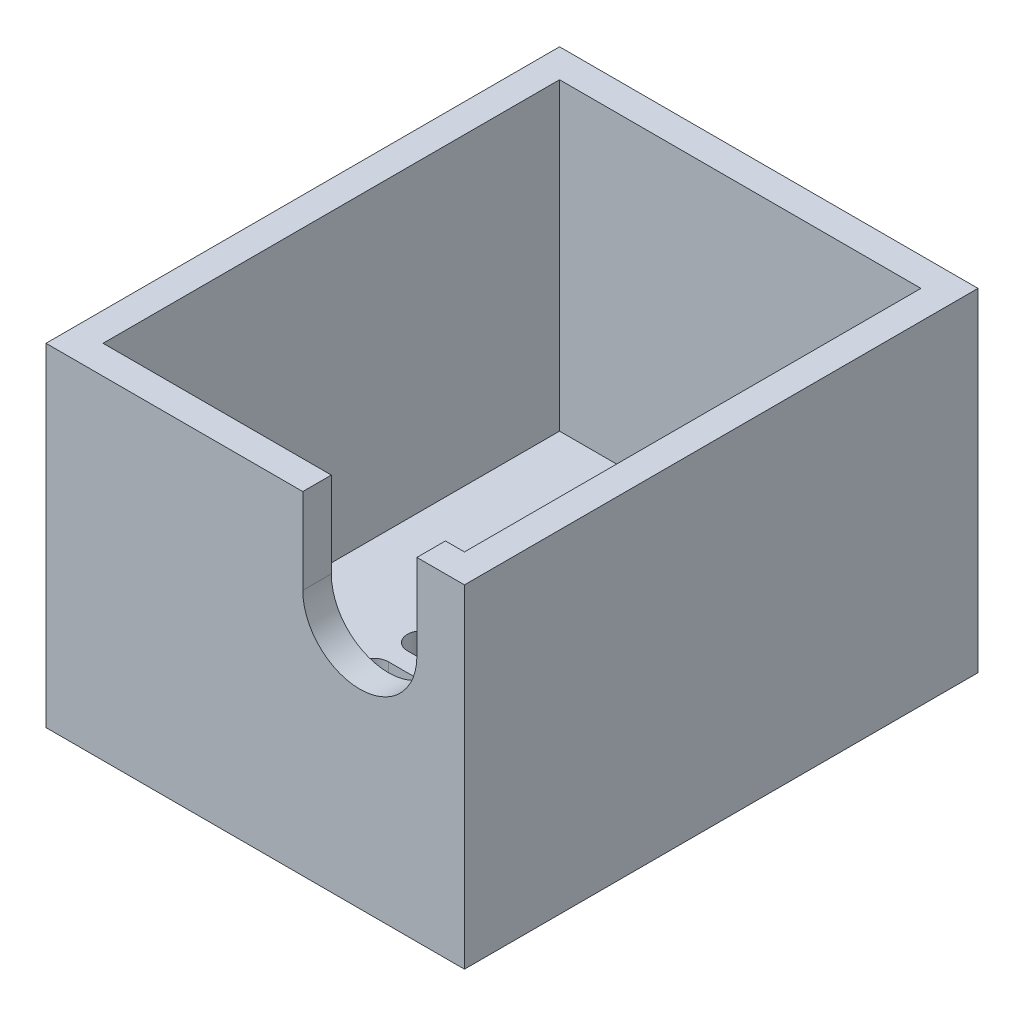
ISO-10303-21;
HEADER;
FILE_DESCRIPTION(('STEP AP214'),'2;1');
FILE_NAME('part.step','',(''),(''),'','','');
FILE_SCHEMA(('AUTOMOTIVE_DESIGN { 1 0 10303 214 1 1 1 1 }'));
ENDSEC;
DATA;
#1=APPLICATION_CONTEXT('core data for automotive mechanical design processes');
#2=APPLICATION_PROTOCOL_DEFINITION('international standard','automotive_design',2000,#1);
#3=PRODUCT_CONTEXT('',#1,'mechanical');
#4=PRODUCT('Part','Part','',(#3));
#5=PRODUCT_RELATED_PRODUCT_CATEGORY('part','',(#4));
#6=PRODUCT_DEFINITION_FORMATION('','',#4);
#7=PRODUCT_DEFINITION_CONTEXT('part definition',#1,'design');
#8=PRODUCT_DEFINITION('design','',#6,#7);
#9=PRODUCT_DEFINITION_SHAPE('','',#8);
#10=(LENGTH_UNIT() NAMED_UNIT(*) SI_UNIT(.MILLI.,.METRE.));
#11=(NAMED_UNIT(*) PLANE_ANGLE_UNIT() SI_UNIT($,.RADIAN.));
#12=(NAMED_UNIT(*) SI_UNIT($,.STERADIAN.) SOLID_ANGLE_UNIT());
#13=UNCERTAINTY_MEASURE_WITH_UNIT(LENGTH_MEASURE(1.E-05),#10,'distance_accuracy_value','');
#14=(GEOMETRIC_REPRESENTATION_CONTEXT(3) GLOBAL_UNCERTAINTY_ASSIGNED_CONTEXT((#13)) GLOBAL_UNIT_ASSIGNED_CONTEXT((#10,
#11,#12)) REPRESENTATION_CONTEXT('',''));
#15=CARTESIAN_POINT('',(0.,0.,0.));
#16=DIRECTION('',(0.,0.,1.));
#17=DIRECTION('',(1.,0.,0.));
#18=AXIS2_PLACEMENT_3D('',#15,#16,#17);
#19=CARTESIAN_POINT('',(0.,0.,0.));
#20=DIRECTION('',(0.,1.,0.));
#21=DIRECTION('',(0.,0.,1.));
#22=AXIS2_PLACEMENT_3D('',#19,#20,#21);
#23=PLANE('',#22);
#24=CARTESIAN_POINT('',(-14.3175352869094,0.,12.2543910077003));
#25=DIRECTION('',(0.,1.,0.));
#26=DIRECTION('',(0.,0.,1.));
#27=AXIS2_PLACEMENT_3D('',#24,#25,#26);
#28=CIRCLE('',#27,1.5);
#29=CARTESIAN_POINT('',(-14.3175352869094,0.,13.7543910077003));
#30=VERTEX_POINT('',#29);
#31=CARTESIAN_POINT('',(-14.3175352869094,0.,10.7543910077003));
#32=VERTEX_POINT('',#31);
#33=EDGE_CURVE('E332',#30,#32,#28,.F.);
#34=ORIENTED_EDGE('',*,*,#33,.F.);
#35=DIRECTION('',(-1.,0.,0.));
#36=VECTOR('',#35,1.);
#37=CARTESIAN_POINT('',(0.,0.,13.7543910077003));
#38=LINE('',#37,#36);
#39=CARTESIAN_POINT('',(-0.317535286909441,0.,13.7543910077003));
#40=VERTEX_POINT('',#39);
#41=EDGE_CURVE('E334',#40,#30,#38,.T.);
#42=ORIENTED_EDGE('',*,*,#41,.F.);
#43=CARTESIAN_POINT('',(-0.317535286909443,0.,12.2543910077003));
#44=DIRECTION('',(0.,1.,0.));
#45=DIRECTION('',(0.,0.,1.));
#46=AXIS2_PLACEMENT_3D('',#43,#44,#45);
#47=CIRCLE('',#46,1.5);
#48=CARTESIAN_POINT('',(-0.317535286909441,0.,10.7543910077003));
#49=VERTEX_POINT('',#48);
#50=EDGE_CURVE('E337',#40,#49,#47,.T.);
#51=ORIENTED_EDGE('',*,*,#50,.T.);
#52=DIRECTION('',(1.,0.,0.));
#53=VECTOR('',#52,1.);
#54=CARTESIAN_POINT('',(0.,0.,10.7543910077003));
#55=LINE('',#54,#53);
#56=EDGE_CURVE('E340',#32,#49,#55,.T.);
#57=ORIENTED_EDGE('',*,*,#56,.F.);
#58=EDGE_LOOP('',(#34,#42,#51,#57));
#59=FACE_BOUND('',#58,.T.);
#60=DIRECTION('',(1.,0.,0.));
#61=VECTOR('',#60,1.);
#62=CARTESIAN_POINT('',(0.,0.,0.75439100770033));
#63=LINE('',#62,#61);
#64=CARTESIAN_POINT('',(-14.3175352869094,0.,0.75439100770033));
#65=VERTEX_POINT('',#64);
#66=CARTESIAN_POINT('',(-0.317535286909441,0.,0.75439100770033));
#67=VERTEX_POINT('',#66);
#68=EDGE_CURVE('E394',#65,#67,#63,.T.);
#69=ORIENTED_EDGE('',*,*,#68,.F.);
#70=CARTESIAN_POINT('',(-14.3175352869094,0.,2.25439100770033));
#71=DIRECTION('',(0.,1.,0.));
#72=DIRECTION('',(0.,0.,1.));
#73=AXIS2_PLACEMENT_3D('',#70,#71,#72);
#74=CIRCLE('',#73,1.5);
#75=CARTESIAN_POINT('',(-14.3175352869094,0.,3.75439100770033));
#76=VERTEX_POINT('',#75);
#77=EDGE_CURVE('E396',#65,#76,#74,.T.);
#78=ORIENTED_EDGE('',*,*,#77,.T.);
#79=DIRECTION('',(-1.,0.,0.));
#80=VECTOR('',#79,1.);
#81=CARTESIAN_POINT('',(0.,0.,3.75439100770033));
#82=LINE('',#81,#80);
#83=CARTESIAN_POINT('',(-0.317535286909441,0.,3.75439100770033));
#84=VERTEX_POINT('',#83);
#85=EDGE_CURVE('E400',#84,#76,#82,.T.);
#86=ORIENTED_EDGE('',*,*,#85,.F.);
#87=CARTESIAN_POINT('',(-0.317535286909444,0.,2.25439100770033));
#88=DIRECTION('',(0.,1.,0.));
#89=DIRECTION('',(0.,0.,1.));
#90=AXIS2_PLACEMENT_3D('',#87,#88,#89);
#91=CIRCLE('',#90,1.5);
#92=EDGE_CURVE('E403',#84,#67,#91,.T.);
#93=ORIENTED_EDGE('',*,*,#92,.T.);
#94=EDGE_LOOP('',(#69,#78,#86,#93));
#95=FACE_BOUND('',#94,.T.);
#96=DIRECTION('',(0.,0.,1.));
#97=VECTOR('',#96,1.);
#98=CARTESIAN_POINT('',(-29.3175352869094,0.,-17.2456089922997));
#99=LINE('',#98,#97);
#100=CARTESIAN_POINT('',(-29.3175352869094,0.,-17.2456089922997));
#101=VERTEX_POINT('',#100);
#102=CARTESIAN_POINT('',(-29.3175352869094,0.,36.7543910077003));
#103=VERTEX_POINT('',#102);
#104=EDGE_CURVE('E259',#101,#103,#99,.T.);
#105=ORIENTED_EDGE('',*,*,#104,.F.);
#106=DIRECTION('',(-1.,0.,0.));
#107=VECTOR('',#106,1.);
#108=CARTESIAN_POINT('',(-29.3175352869094,0.,-17.2456089922997));
#109=LINE('',#108,#107);
#110=CARTESIAN_POINT('',(14.6824647130906,0.,-17.2456089922997));
#111=VERTEX_POINT('',#110);
#112=EDGE_CURVE('E251',#111,#101,#109,.T.);
#113=ORIENTED_EDGE('',*,*,#112,.F.);
#114=DIRECTION('',(0.,0.,-1.));
#115=VECTOR('',#114,1.);
#116=CARTESIAN_POINT('',(14.6824647130906,0.,-17.2456089922997));
#117=LINE('',#116,#115);
#118=CARTESIAN_POINT('',(14.6824647130906,0.,36.7543910077003));
#119=VERTEX_POINT('',#118);
#120=EDGE_CURVE('E265',#119,#111,#117,.T.);
#121=ORIENTED_EDGE('',*,*,#120,.F.);
#122=DIRECTION('',(1.,0.,0.));
#123=VECTOR('',#122,1.);
#124=CARTESIAN_POINT('',(-29.3175352869094,0.,36.7543910077003));
#125=LINE('',#124,#123);
#126=EDGE_CURVE('E262',#103,#119,#125,.T.);
#127=ORIENTED_EDGE('',*,*,#126,.F.);
#128=EDGE_LOOP('',(#105,#113,#121,#127));
#129=FACE_BOUND('',#128,.T.);
#130=CARTESIAN_POINT('',(-14.3175352869094,0.,7.25439100770033));
#131=DIRECTION('',(0.,1.,0.));
#132=DIRECTION('',(0.,0.,1.));
#133=AXIS2_PLACEMENT_3D('',#130,#131,#132);
#134=CIRCLE('',#133,1.5);
#135=CARTESIAN_POINT('',(-14.3175352869094,0.,8.75439100770033));
#136=VERTEX_POINT('',#135);
#137=CARTESIAN_POINT('',(-14.3175352869094,0.,5.75439100770033));
#138=VERTEX_POINT('',#137);
#139=EDGE_CURVE('E363',#136,#138,#134,.F.);
#140=ORIENTED_EDGE('',*,*,#139,.F.);
#141=DIRECTION('',(-1.,0.,0.));
#142=VECTOR('',#141,1.);
#143=CARTESIAN_POINT('',(0.,0.,8.75439100770033));
#144=LINE('',#143,#142);
#145=CARTESIAN_POINT('',(-0.317535286909441,0.,8.75439100770033));
#146=VERTEX_POINT('',#145);
#147=EDGE_CURVE('E365',#146,#136,#144,.T.);
#148=ORIENTED_EDGE('',*,*,#147,.F.);
#149=CARTESIAN_POINT('',(-0.317535286909442,0.,7.25439100770033));
#150=DIRECTION('',(0.,1.,0.));
#151=DIRECTION('',(0.,0.,1.));
#152=AXIS2_PLACEMENT_3D('',#149,#150,#151);
#153=CIRCLE('',#152,1.5);
#154=CARTESIAN_POINT('',(-0.317535286909441,0.,5.75439100770033));
#155=VERTEX_POINT('',#154);
#156=EDGE_CURVE('E368',#146,#155,#153,.T.);
#157=ORIENTED_EDGE('',*,*,#156,.T.);
#158=DIRECTION('',(1.,0.,0.));
#159=VECTOR('',#158,1.);
#160=CARTESIAN_POINT('',(0.,0.,5.75439100770033));
#161=LINE('',#160,#159);
#162=EDGE_CURVE('E371',#138,#155,#161,.T.);
#163=ORIENTED_EDGE('',*,*,#162,.F.);
#164=EDGE_LOOP('',(#140,#148,#157,#163));
#165=FACE_BOUND('',#164,.T.);
#166=CARTESIAN_POINT('',(-14.3175352869094,0.,17.2543910077003));
#167=DIRECTION('',(0.,1.,0.));
#168=DIRECTION('',(0.,0.,1.));
#169=AXIS2_PLACEMENT_3D('',#166,#167,#168);
#170=CIRCLE('',#169,1.5);
#171=CARTESIAN_POINT('',(-14.3175352869094,0.,18.7543910077003));
#172=VERTEX_POINT('',#171);
#173=CARTESIAN_POINT('',(-14.3175352869094,0.,15.7543910077003));
#174=VERTEX_POINT('',#173);
#175=EDGE_CURVE('E303',#172,#174,#170,.F.);
#176=ORIENTED_EDGE('',*,*,#175,.F.);
#177=DIRECTION('',(-1.,0.,0.));
#178=VECTOR('',#177,1.);
#179=CARTESIAN_POINT('',(0.,0.,18.7543910077003));
#180=LINE('',#179,#178);
#181=CARTESIAN_POINT('',(-0.317535286909441,0.,18.7543910077003));
#182=VERTEX_POINT('',#181);
#183=EDGE_CURVE('E305',#182,#172,#180,.T.);
#184=ORIENTED_EDGE('',*,*,#183,.F.);
#185=CARTESIAN_POINT('',(-0.317535286909441,0.,17.2543910077003));
#186=DIRECTION('',(0.,1.,0.));
#187=DIRECTION('',(0.,0.,1.));
#188=AXIS2_PLACEMENT_3D('',#185,#186,#187);
#189=CIRCLE('',#188,1.5);
#190=CARTESIAN_POINT('',(-0.317535286909441,0.,15.7543910077003));
#191=VERTEX_POINT('',#190);
#192=EDGE_CURVE('E56',#182,#191,#189,.T.);
#193=ORIENTED_EDGE('',*,*,#192,.T.);
#194=DIRECTION('',(1.,0.,0.));
#195=VECTOR('',#194,1.);
#196=CARTESIAN_POINT('',(0.,0.,15.7543910077003));
#197=LINE('',#196,#195);
#198=EDGE_CURVE('E309',#174,#191,#197,.T.);
#199=ORIENTED_EDGE('',*,*,#198,.F.);
#200=EDGE_LOOP('',(#176,#184,#193,#199));
#201=FACE_BOUND('',#200,.T.);
#202=ADVANCED_FACE('F33',(#59,#95,#129,#165,#201),#23,.F.);
#203=CARTESIAN_POINT('',(0.,3.,0.));
#204=DIRECTION('',(0.,1.,0.));
#205=DIRECTION('',(0.,0.,1.));
#206=AXIS2_PLACEMENT_3D('',#203,#204,#205);
#207=PLANE('',#206);
#208=DIRECTION('',(-1.,0.,0.));
#209=VECTOR('',#208,1.);
#210=CARTESIAN_POINT('',(0.,3.,13.7543910077003));
#211=LINE('',#210,#209);
#212=CARTESIAN_POINT('',(-0.317535286909441,3.,13.7543910077003));
#213=VERTEX_POINT('',#212);
#214=CARTESIAN_POINT('',(-14.3175352869094,3.,13.7543910077003));
#215=VERTEX_POINT('',#214);
#216=EDGE_CURVE('E345',#213,#215,#211,.T.);
#217=ORIENTED_EDGE('',*,*,#216,.T.);
#218=CARTESIAN_POINT('',(-14.3175352869094,3.,12.2543910077003));
#219=DIRECTION('',(0.,1.,0.));
#220=DIRECTION('',(0.,0.,1.));
#221=AXIS2_PLACEMENT_3D('',#218,#219,#220);
#222=CIRCLE('',#221,1.5);
#223=CARTESIAN_POINT('',(-14.3175352869094,3.,10.7543910077003));
#224=VERTEX_POINT('',#223);
#225=EDGE_CURVE('E325',#215,#224,#222,.F.);
#226=ORIENTED_EDGE('',*,*,#225,.T.);
#227=DIRECTION('',(1.,0.,0.));
#228=VECTOR('',#227,1.);
#229=CARTESIAN_POINT('',(0.,3.,10.7543910077003));
#230=LINE('',#229,#228);
#231=CARTESIAN_POINT('',(-0.317535286909441,3.,10.7543910077003));
#232=VERTEX_POINT('',#231);
#233=EDGE_CURVE('E335',#224,#232,#230,.T.);
#234=ORIENTED_EDGE('',*,*,#233,.T.);
#235=CARTESIAN_POINT('',(-0.317535286909443,3.,12.2543910077003));
#236=DIRECTION('',(0.,1.,0.));
#237=DIRECTION('',(0.,0.,1.));
#238=AXIS2_PLACEMENT_3D('',#235,#236,#237);
#239=CIRCLE('',#238,1.5);
#240=EDGE_CURVE('E348',#213,#232,#239,.T.);
#241=ORIENTED_EDGE('',*,*,#240,.F.);
#242=EDGE_LOOP('',(#217,#226,#234,#241));
#243=FACE_BOUND('',#242,.T.);
#244=CARTESIAN_POINT('',(-14.3175352869094,3.,2.25439100770033));
#245=DIRECTION('',(0.,1.,0.));
#246=DIRECTION('',(0.,0.,1.));
#247=AXIS2_PLACEMENT_3D('',#244,#245,#246);
#248=CIRCLE('',#247,1.5);
#249=CARTESIAN_POINT('',(-14.3175352869094,3.,0.75439100770033));
#250=VERTEX_POINT('',#249);
#251=CARTESIAN_POINT('',(-14.3175352869094,3.,3.75439100770033));
#252=VERTEX_POINT('',#251);
#253=EDGE_CURVE('E409',#250,#252,#248,.T.);
#254=ORIENTED_EDGE('',*,*,#253,.F.);
#255=DIRECTION('',(1.,0.,0.));
#256=VECTOR('',#255,1.);
#257=CARTESIAN_POINT('',(0.,3.,0.75439100770033));
#258=LINE('',#257,#256);
#259=CARTESIAN_POINT('',(-0.317535286909441,3.,0.75439100770033));
#260=VERTEX_POINT('',#259);
#261=EDGE_CURVE('E387',#250,#260,#258,.T.);
#262=ORIENTED_EDGE('',*,*,#261,.T.);
#263=CARTESIAN_POINT('',(-0.317535286909444,3.,2.25439100770033));
#264=DIRECTION('',(0.,1.,0.));
#265=DIRECTION('',(0.,0.,1.));
#266=AXIS2_PLACEMENT_3D('',#263,#264,#265);
#267=CIRCLE('',#266,1.5);
#268=CARTESIAN_POINT('',(-0.317535286909441,3.,3.75439100770033));
#269=VERTEX_POINT('',#268);
#270=EDGE_CURVE('E397',#269,#260,#267,.T.);
#271=ORIENTED_EDGE('',*,*,#270,.F.);
#272=DIRECTION('',(-1.,0.,0.));
#273=VECTOR('',#272,1.);
#274=CARTESIAN_POINT('',(0.,3.,3.75439100770033));
#275=LINE('',#274,#273);
#276=EDGE_CURVE('E412',#269,#252,#275,.T.);
#277=ORIENTED_EDGE('',*,*,#276,.T.);
#278=EDGE_LOOP('',(#254,#262,#271,#277));
#279=FACE_BOUND('',#278,.T.);
#280=DIRECTION('',(0.,0.,1.));
#281=VECTOR('',#280,1.);
#282=CARTESIAN_POINT('',(-26.3175352869094,3.,-17.2456089922997));
#283=LINE('',#282,#281);
#284=CARTESIAN_POINT('',(-26.3175352869094,3.,-14.2456089922997));
#285=VERTEX_POINT('',#284);
#286=CARTESIAN_POINT('',(-26.3175352869094,3.,33.7543910077003));
#287=VERTEX_POINT('',#286);
#288=EDGE_CURVE('E419',#285,#287,#283,.T.);
#289=ORIENTED_EDGE('',*,*,#288,.T.);
#290=DIRECTION('',(1.,0.,0.));
#291=VECTOR('',#290,1.);
#292=CARTESIAN_POINT('',(-29.3175352869094,3.,33.7543910077003));
#293=LINE('',#292,#291);
#294=CARTESIAN_POINT('',(11.6824647130906,3.,33.7543910077003));
#295=VERTEX_POINT('',#294);
#296=EDGE_CURVE('E428',#287,#295,#293,.T.);
#297=ORIENTED_EDGE('',*,*,#296,.T.);
#298=DIRECTION('',(0.,0.,-1.));
#299=VECTOR('',#298,1.);
#300=CARTESIAN_POINT('',(11.6824647130906,3.,-17.2456089922997));
#301=LINE('',#300,#299);
#302=CARTESIAN_POINT('',(11.6824647130906,3.,-14.2456089922997));
#303=VERTEX_POINT('',#302);
#304=EDGE_CURVE('E438',#295,#303,#301,.T.);
#305=ORIENTED_EDGE('',*,*,#304,.T.);
#306=DIRECTION('',(-1.,0.,0.));
#307=VECTOR('',#306,1.);
#308=CARTESIAN_POINT('',(-29.3175352869094,3.,-14.2456089922997));
#309=LINE('',#308,#307);
#310=EDGE_CURVE('E442',#303,#285,#309,.T.);
#311=ORIENTED_EDGE('',*,*,#310,.T.);
#312=EDGE_LOOP('',(#289,#297,#305,#311));
#313=FACE_BOUND('',#312,.T.);
#314=DIRECTION('',(-1.,0.,0.));
#315=VECTOR('',#314,1.);
#316=CARTESIAN_POINT('',(0.,3.,8.75439100770033));
#317=LINE('',#316,#315);
#318=CARTESIAN_POINT('',(-0.317535286909441,3.,8.75439100770033));
#319=VERTEX_POINT('',#318);
#320=CARTESIAN_POINT('',(-14.3175352869094,3.,8.75439100770033));
#321=VERTEX_POINT('',#320);
#322=EDGE_CURVE('E376',#319,#321,#317,.T.);
#323=ORIENTED_EDGE('',*,*,#322,.T.);
#324=CARTESIAN_POINT('',(-14.3175352869094,3.,7.25439100770033));
#325=DIRECTION('',(0.,1.,0.));
#326=DIRECTION('',(0.,0.,1.));
#327=AXIS2_PLACEMENT_3D('',#324,#325,#326);
#328=CIRCLE('',#327,1.5);
#329=CARTESIAN_POINT('',(-14.3175352869094,3.,5.75439100770033));
#330=VERTEX_POINT('',#329);
#331=EDGE_CURVE('E356',#321,#330,#328,.F.);
#332=ORIENTED_EDGE('',*,*,#331,.T.);
#333=DIRECTION('',(1.,0.,0.));
#334=VECTOR('',#333,1.);
#335=CARTESIAN_POINT('',(0.,3.,5.75439100770033));
#336=LINE('',#335,#334);
#337=CARTESIAN_POINT('',(-0.317535286909441,3.,5.75439100770033));
#338=VERTEX_POINT('',#337);
#339=EDGE_CURVE('E366',#330,#338,#336,.T.);
#340=ORIENTED_EDGE('',*,*,#339,.T.);
#341=CARTESIAN_POINT('',(-0.317535286909442,3.,7.25439100770033));
#342=DIRECTION('',(0.,1.,0.));
#343=DIRECTION('',(0.,0.,1.));
#344=AXIS2_PLACEMENT_3D('',#341,#342,#343);
#345=CIRCLE('',#344,1.5);
#346=EDGE_CURVE('E379',#319,#338,#345,.T.);
#347=ORIENTED_EDGE('',*,*,#346,.F.);
#348=EDGE_LOOP('',(#323,#332,#340,#347));
#349=FACE_BOUND('',#348,.T.);
#350=DIRECTION('',(-1.,0.,0.));
#351=VECTOR('',#350,1.);
#352=CARTESIAN_POINT('',(0.,3.,18.7543910077003));
#353=LINE('',#352,#351);
#354=CARTESIAN_POINT('',(-0.317535286909441,3.,18.7543910077003));
#355=VERTEX_POINT('',#354);
#356=CARTESIAN_POINT('',(-14.3175352869094,3.,18.7543910077003));
#357=VERTEX_POINT('',#356);
#358=EDGE_CURVE('E314',#355,#357,#353,.T.);
#359=ORIENTED_EDGE('',*,*,#358,.T.);
#360=CARTESIAN_POINT('',(-14.3175352869094,3.,17.2543910077003));
#361=DIRECTION('',(0.,1.,0.));
#362=DIRECTION('',(0.,0.,1.));
#363=AXIS2_PLACEMENT_3D('',#360,#361,#362);
#364=CIRCLE('',#363,1.5);
#365=CARTESIAN_POINT('',(-14.3175352869094,3.,15.7543910077003));
#366=VERTEX_POINT('',#365);
#367=EDGE_CURVE('E229',#357,#366,#364,.F.);
#368=ORIENTED_EDGE('',*,*,#367,.T.);
#369=DIRECTION('',(1.,0.,0.));
#370=VECTOR('',#369,1.);
#371=CARTESIAN_POINT('',(0.,3.,15.7543910077003));
#372=LINE('',#371,#370);
#373=CARTESIAN_POINT('',(-0.317535286909441,3.,15.7543910077003));
#374=VERTEX_POINT('',#373);
#375=EDGE_CURVE('E306',#366,#374,#372,.T.);
#376=ORIENTED_EDGE('',*,*,#375,.T.);
#377=CARTESIAN_POINT('',(-0.317535286909441,3.,17.2543910077003));
#378=DIRECTION('',(0.,1.,0.));
#379=DIRECTION('',(0.,0.,1.));
#380=AXIS2_PLACEMENT_3D('',#377,#378,#379);
#381=CIRCLE('',#380,1.5);
#382=EDGE_CURVE('E317',#355,#374,#381,.T.);
#383=ORIENTED_EDGE('',*,*,#382,.F.);
#384=EDGE_LOOP('',(#359,#368,#376,#383));
#385=FACE_BOUND('',#384,.T.);
#386=ADVANCED_FACE('F466',(#243,#279,#313,#349,#385),#207,.T.);
#387=CARTESIAN_POINT('',(-29.3175352869094,35.,-17.2456089922997));
#388=DIRECTION('',(1.,0.,0.));
#389=DIRECTION('',(0.,0.,-1.));
#390=AXIS2_PLACEMENT_3D('',#387,#388,#389);
#391=PLANE('',#390);
#392=ORIENTED_EDGE('',*,*,#104,.T.);
#393=DIRECTION('',(0.,-1.,0.));
#394=VECTOR('',#393,1.);
#395=CARTESIAN_POINT('',(-29.3175352869094,35.,36.7543910077003));
#396=LINE('',#395,#394);
#397=CARTESIAN_POINT('',(-29.3175352869094,35.,36.7543910077003));
#398=VERTEX_POINT('',#397);
#399=EDGE_CURVE('E11',#398,#103,#396,.T.);
#400=ORIENTED_EDGE('',*,*,#399,.F.);
#401=DIRECTION('',(0.,0.,1.));
#402=VECTOR('',#401,1.);
#403=CARTESIAN_POINT('',(-29.3175352869094,35.,-17.2456089922997));
#404=LINE('',#403,#402);
#405=CARTESIAN_POINT('',(-29.3175352869094,35.,-17.2456089922997));
#406=VERTEX_POINT('',#405);
#407=EDGE_CURVE('E246',#406,#398,#404,.T.);
#408=ORIENTED_EDGE('',*,*,#407,.F.);
#409=DIRECTION('',(0.,-1.,0.));
#410=VECTOR('',#409,1.);
#411=CARTESIAN_POINT('',(-29.3175352869094,35.,-17.2456089922997));
#412=LINE('',#411,#410);
#413=EDGE_CURVE('E258',#406,#101,#412,.T.);
#414=ORIENTED_EDGE('',*,*,#413,.T.);
#415=EDGE_LOOP('',(#392,#400,#408,#414));
#416=FACE_BOUND('',#415,.T.);
#417=ADVANCED_FACE('F35',(#416),#391,.F.);
#418=CARTESIAN_POINT('',(-29.3175352869094,35.,36.7543910077003));
#419=DIRECTION('',(0.,0.,-1.));
#420=DIRECTION('',(-1.,0.,0.));
#421=AXIS2_PLACEMENT_3D('',#418,#419,#420);
#422=PLANE('',#421);
#423=DIRECTION('',(1.,0.,0.));
#424=VECTOR('',#423,1.);
#425=CARTESIAN_POINT('',(-29.3175352869094,35.,36.7543910077003));
#426=LINE('',#425,#424);
#427=CARTESIAN_POINT('',(9.68246471309056,35.,36.7543910077003));
#428=VERTEX_POINT('',#427);
#429=CARTESIAN_POINT('',(14.6824647130906,35.,36.7543910077003));
#430=VERTEX_POINT('',#429);
#431=EDGE_CURVE('E235',#428,#430,#426,.T.);
#432=ORIENTED_EDGE('',*,*,#431,.F.);
#433=DIRECTION('',(0.,1.,0.));
#434=VECTOR('',#433,1.);
#435=CARTESIAN_POINT('',(9.68246471309056,35.,36.7543910077003));
#436=LINE('',#435,#434);
#437=CARTESIAN_POINT('',(9.68246471309056,26.,36.7543910077003));
#438=VERTEX_POINT('',#437);
#439=EDGE_CURVE('E218',#438,#428,#436,.T.);
#440=ORIENTED_EDGE('',*,*,#439,.F.);
#441=CARTESIAN_POINT('',(3.68246471309056,26.,36.7543910077003));
#442=DIRECTION('',(0.,0.,1.));
#443=DIRECTION('',(1.,0.,0.));
#444=AXIS2_PLACEMENT_3D('',#441,#442,#443);
#445=CIRCLE('',#444,6.);
#446=CARTESIAN_POINT('',(-2.31753528690944,26.,36.7543910077003));
#447=VERTEX_POINT('',#446);
#448=EDGE_CURVE('E230',#447,#438,#445,.T.);
#449=ORIENTED_EDGE('',*,*,#448,.F.);
#450=DIRECTION('',(0.,-1.,0.));
#451=VECTOR('',#450,1.);
#452=CARTESIAN_POINT('',(-2.31753528690944,35.,36.7543910077003));
#453=LINE('',#452,#451);
#454=CARTESIAN_POINT('',(-2.31753528690944,35.,36.7543910077003));
#455=VERTEX_POINT('',#454);
#456=EDGE_CURVE('E292',#455,#447,#453,.T.);
#457=ORIENTED_EDGE('',*,*,#456,.F.);
#458=EDGE_CURVE('E245',#398,#455,#426,.T.);
#459=ORIENTED_EDGE('',*,*,#458,.F.);
#460=ORIENTED_EDGE('',*,*,#399,.T.);
#461=ORIENTED_EDGE('',*,*,#126,.T.);
#462=DIRECTION('',(0.,-1.,0.));
#463=VECTOR('',#462,1.);
#464=CARTESIAN_POINT('',(14.6824647130906,35.,36.7543910077003));
#465=LINE('',#464,#463);
#466=EDGE_CURVE('E41',#430,#119,#465,.T.);
#467=ORIENTED_EDGE('',*,*,#466,.F.);
#468=EDGE_LOOP('',(#432,#440,#449,#457,#459,#460,#461,#467));
#469=FACE_BOUND('',#468,.T.);
#470=ADVANCED_FACE('F242',(#469),#422,.F.);
#471=CARTESIAN_POINT('',(14.6824647130906,35.,-17.2456089922997));
#472=DIRECTION('',(-1.,0.,0.));
#473=DIRECTION('',(0.,0.,1.));
#474=AXIS2_PLACEMENT_3D('',#471,#472,#473);
#475=PLANE('',#474);
#476=ORIENTED_EDGE('',*,*,#120,.T.);
#477=DIRECTION('',(0.,-1.,0.));
#478=VECTOR('',#477,1.);
#479=CARTESIAN_POINT('',(14.6824647130906,35.,-17.2456089922997));
#480=LINE('',#479,#478);
#481=CARTESIAN_POINT('',(14.6824647130906,35.,-17.2456089922997));
#482=VERTEX_POINT('',#481);
#483=EDGE_CURVE('E270',#482,#111,#480,.T.);
#484=ORIENTED_EDGE('',*,*,#483,.F.);
#485=DIRECTION('',(0.,0.,-1.));
#486=VECTOR('',#485,1.);
#487=CARTESIAN_POINT('',(14.6824647130906,35.,-17.2456089922997));
#488=LINE('',#487,#486);
#489=EDGE_CURVE('E249',#430,#482,#488,.T.);
#490=ORIENTED_EDGE('',*,*,#489,.F.);
#491=ORIENTED_EDGE('',*,*,#466,.T.);
#492=EDGE_LOOP('',(#476,#484,#490,#491));
#493=FACE_BOUND('',#492,.T.);
#494=ADVANCED_FACE('F274',(#493),#475,.F.);
#495=CARTESIAN_POINT('',(-29.3175352869094,35.,-17.2456089922997));
#496=DIRECTION('',(0.,0.,1.));
#497=DIRECTION('',(1.,0.,0.));
#498=AXIS2_PLACEMENT_3D('',#495,#496,#497);
#499=PLANE('',#498);
#500=ORIENTED_EDGE('',*,*,#112,.T.);
#501=ORIENTED_EDGE('',*,*,#413,.F.);
#502=DIRECTION('',(-1.,0.,0.));
#503=VECTOR('',#502,1.);
#504=CARTESIAN_POINT('',(-29.3175352869094,35.,-17.2456089922997));
#505=LINE('',#504,#503);
#506=EDGE_CURVE('E256',#482,#406,#505,.T.);
#507=ORIENTED_EDGE('',*,*,#506,.F.);
#508=ORIENTED_EDGE('',*,*,#483,.T.);
#509=EDGE_LOOP('',(#500,#501,#507,#508));
#510=FACE_BOUND('',#509,.T.);
#511=ADVANCED_FACE('F282',(#510),#499,.F.);
#512=CARTESIAN_POINT('',(0.,35.,0.));
#513=DIRECTION('',(0.,1.,0.));
#514=DIRECTION('',(0.,0.,1.));
#515=AXIS2_PLACEMENT_3D('',#512,#513,#514);
#516=PLANE('',#515);
#517=DIRECTION('',(0.,0.,1.));
#518=VECTOR('',#517,1.);
#519=CARTESIAN_POINT('',(9.68246471309056,35.,-17.2466089922997));
#520=LINE('',#519,#518);
#521=CARTESIAN_POINT('',(9.68246471309056,35.,33.7543910077003));
#522=VERTEX_POINT('',#521);
#523=EDGE_CURVE('E221',#522,#428,#520,.T.);
#524=ORIENTED_EDGE('',*,*,#523,.T.);
#525=ORIENTED_EDGE('',*,*,#431,.T.);
#526=ORIENTED_EDGE('',*,*,#489,.T.);
#527=ORIENTED_EDGE('',*,*,#506,.T.);
#528=ORIENTED_EDGE('',*,*,#407,.T.);
#529=ORIENTED_EDGE('',*,*,#458,.T.);
#530=DIRECTION('',(0.,0.,1.));
#531=VECTOR('',#530,1.);
#532=CARTESIAN_POINT('',(-2.31753528690944,35.,-17.2466089922997));
#533=LINE('',#532,#531);
#534=CARTESIAN_POINT('',(-2.31753528690944,35.,33.7543910077003));
#535=VERTEX_POINT('',#534);
#536=EDGE_CURVE('E289',#535,#455,#533,.T.);
#537=ORIENTED_EDGE('',*,*,#536,.F.);
#538=DIRECTION('',(1.,0.,0.));
#539=VECTOR('',#538,1.);
#540=CARTESIAN_POINT('',(-29.3175352869094,35.,33.7543910077003));
#541=LINE('',#540,#539);
#542=CARTESIAN_POINT('',(-26.3175352869094,35.,33.7543910077003));
#543=VERTEX_POINT('',#542);
#544=EDGE_CURVE('E448',#543,#535,#541,.T.);
#545=ORIENTED_EDGE('',*,*,#544,.F.);
#546=DIRECTION('',(0.,0.,1.));
#547=VECTOR('',#546,1.);
#548=CARTESIAN_POINT('',(-26.3175352869094,35.,-17.2456089922997));
#549=LINE('',#548,#547);
#550=CARTESIAN_POINT('',(-26.3175352869094,35.,-14.2456089922997));
#551=VERTEX_POINT('',#550);
#552=EDGE_CURVE('E446',#551,#543,#549,.T.);
#553=ORIENTED_EDGE('',*,*,#552,.F.);
#554=DIRECTION('',(-1.,0.,0.));
#555=VECTOR('',#554,1.);
#556=CARTESIAN_POINT('',(-29.3175352869094,35.,-14.2456089922997));
#557=LINE('',#556,#555);
#558=CARTESIAN_POINT('',(11.6824647130906,35.,-14.2456089922997));
#559=VERTEX_POINT('',#558);
#560=EDGE_CURVE('E436',#559,#551,#557,.T.);
#561=ORIENTED_EDGE('',*,*,#560,.F.);
#562=DIRECTION('',(0.,0.,-1.));
#563=VECTOR('',#562,1.);
#564=CARTESIAN_POINT('',(11.6824647130906,35.,-17.2456089922997));
#565=LINE('',#564,#563);
#566=CARTESIAN_POINT('',(11.6824647130906,35.,33.7543910077003));
#567=VERTEX_POINT('',#566);
#568=EDGE_CURVE('E450',#567,#559,#565,.T.);
#569=ORIENTED_EDGE('',*,*,#568,.F.);
#570=EDGE_CURVE('E238',#522,#567,#541,.T.);
#571=ORIENTED_EDGE('',*,*,#570,.F.);
#572=EDGE_LOOP('',(#524,#525,#526,#527,#528,#529,#537,#545,#553,#561,#569,#571));
#573=FACE_BOUND('',#572,.T.);
#574=ADVANCED_FACE('F234',(#573),#516,.T.);
#575=CARTESIAN_POINT('',(-26.3175352869094,35.,-17.2456089922997));
#576=DIRECTION('',(1.,0.,0.));
#577=DIRECTION('',(0.,0.,-1.));
#578=AXIS2_PLACEMENT_3D('',#575,#576,#577);
#579=PLANE('',#578);
#580=ORIENTED_EDGE('',*,*,#288,.F.);
#581=DIRECTION('',(0.,-1.,0.));
#582=VECTOR('',#581,1.);
#583=CARTESIAN_POINT('',(-26.3175352869094,35.,-14.2456089922997));
#584=LINE('',#583,#582);
#585=EDGE_CURVE('E432',#551,#285,#584,.T.);
#586=ORIENTED_EDGE('',*,*,#585,.F.);
#587=ORIENTED_EDGE('',*,*,#552,.T.);
#588=DIRECTION('',(0.,-1.,0.));
#589=VECTOR('',#588,1.);
#590=CARTESIAN_POINT('',(-26.3175352869094,35.,33.7543910077003));
#591=LINE('',#590,#589);
#592=EDGE_CURVE('E263',#543,#287,#591,.T.);
#593=ORIENTED_EDGE('',*,*,#592,.T.);
#594=EDGE_LOOP('',(#580,#586,#587,#593));
#595=FACE_BOUND('',#594,.T.);
#596=ADVANCED_FACE('F460',(#595),#579,.T.);
#597=CARTESIAN_POINT('',(-29.3175352869094,35.,33.7543910077003));
#598=DIRECTION('',(0.,0.,-1.));
#599=DIRECTION('',(-1.,0.,0.));
#600=AXIS2_PLACEMENT_3D('',#597,#598,#599);
#601=PLANE('',#600);
#602=DIRECTION('',(0.,1.,0.));
#603=VECTOR('',#602,1.);
#604=CARTESIAN_POINT('',(9.68246471309056,35.,33.7543910077003));
#605=LINE('',#604,#603);
#606=CARTESIAN_POINT('',(9.68246471309056,26.,33.7543910077003));
#607=VERTEX_POINT('',#606);
#608=EDGE_CURVE('E240',#607,#522,#605,.T.);
#609=ORIENTED_EDGE('',*,*,#608,.T.);
#610=ORIENTED_EDGE('',*,*,#570,.T.);
#611=DIRECTION('',(0.,-1.,0.));
#612=VECTOR('',#611,1.);
#613=CARTESIAN_POINT('',(11.6824647130906,35.,33.7543910077003));
#614=LINE('',#613,#612);
#615=EDGE_CURVE('E431',#567,#295,#614,.T.);
#616=ORIENTED_EDGE('',*,*,#615,.T.);
#617=ORIENTED_EDGE('',*,*,#296,.F.);
#618=ORIENTED_EDGE('',*,*,#592,.F.);
#619=ORIENTED_EDGE('',*,*,#544,.T.);
#620=DIRECTION('',(0.,-1.,0.));
#621=VECTOR('',#620,1.);
#622=CARTESIAN_POINT('',(-2.31753528690944,35.,33.7543910077003));
#623=LINE('',#622,#621);
#624=CARTESIAN_POINT('',(-2.31753528690944,26.,33.7543910077003));
#625=VERTEX_POINT('',#624);
#626=EDGE_CURVE('E295',#535,#625,#623,.T.);
#627=ORIENTED_EDGE('',*,*,#626,.T.);
#628=CARTESIAN_POINT('',(3.68246471309056,26.,33.7543910077003));
#629=DIRECTION('',(0.,0.,-1.));
#630=DIRECTION('',(-1.,0.,0.));
#631=AXIS2_PLACEMENT_3D('',#628,#629,#630);
#632=CIRCLE('',#631,6.);
#633=EDGE_CURVE('E239',#625,#607,#632,.F.);
#634=ORIENTED_EDGE('',*,*,#633,.T.);
#635=EDGE_LOOP('',(#609,#610,#616,#617,#618,#619,#627,#634));
#636=FACE_BOUND('',#635,.T.);
#637=ADVANCED_FACE('F464',(#636),#601,.T.);
#638=CARTESIAN_POINT('',(11.6824647130906,35.,-17.2456089922997));
#639=DIRECTION('',(-1.,0.,0.));
#640=DIRECTION('',(0.,0.,1.));
#641=AXIS2_PLACEMENT_3D('',#638,#639,#640);
#642=PLANE('',#641);
#643=ORIENTED_EDGE('',*,*,#304,.F.);
#644=ORIENTED_EDGE('',*,*,#615,.F.);
#645=ORIENTED_EDGE('',*,*,#568,.T.);
#646=DIRECTION('',(0.,-1.,0.));
#647=VECTOR('',#646,1.);
#648=CARTESIAN_POINT('',(11.6824647130905,35.,-14.2456089922997));
#649=LINE('',#648,#647);
#650=EDGE_CURVE('E435',#559,#303,#649,.T.);
#651=ORIENTED_EDGE('',*,*,#650,.T.);
#652=EDGE_LOOP('',(#643,#644,#645,#651));
#653=FACE_BOUND('',#652,.T.);
#654=ADVANCED_FACE('F471',(#653),#642,.T.);
#655=CARTESIAN_POINT('',(-29.3175352869094,35.,-14.2456089922997));
#656=DIRECTION('',(0.,0.,1.));
#657=DIRECTION('',(1.,0.,0.));
#658=AXIS2_PLACEMENT_3D('',#655,#656,#657);
#659=PLANE('',#658);
#660=ORIENTED_EDGE('',*,*,#310,.F.);
#661=ORIENTED_EDGE('',*,*,#650,.F.);
#662=ORIENTED_EDGE('',*,*,#560,.T.);
#663=ORIENTED_EDGE('',*,*,#585,.T.);
#664=EDGE_LOOP('',(#660,#661,#662,#663));
#665=FACE_BOUND('',#664,.T.);
#666=ADVANCED_FACE('F456',(#665),#659,.T.);
#667=CARTESIAN_POINT('',(0.,0.,0.75439100770033));
#668=DIRECTION('',(0.,0.,1.));
#669=DIRECTION('',(1.,0.,0.));
#670=AXIS2_PLACEMENT_3D('',#667,#668,#669);
#671=PLANE('',#670);
#672=ORIENTED_EDGE('',*,*,#261,.F.);
#673=DIRECTION('',(0.,1.,0.));
#674=VECTOR('',#673,1.);
#675=CARTESIAN_POINT('',(-14.3175352869094,0.,0.75439100770033));
#676=LINE('',#675,#674);
#677=EDGE_CURVE('E406',#65,#250,#676,.T.);
#678=ORIENTED_EDGE('',*,*,#677,.F.);
#679=ORIENTED_EDGE('',*,*,#68,.T.);
#680=DIRECTION('',(0.,1.,0.));
#681=VECTOR('',#680,1.);
#682=CARTESIAN_POINT('',(-0.317535286909441,0.,0.75439100770033));
#683=LINE('',#682,#681);
#684=EDGE_CURVE('E417',#67,#260,#683,.T.);
#685=ORIENTED_EDGE('',*,*,#684,.T.);
#686=EDGE_LOOP('',(#672,#678,#679,#685));
#687=FACE_BOUND('',#686,.T.);
#688=ADVANCED_FACE('F519',(#687),#671,.T.);
#689=CARTESIAN_POINT('',(-0.317535286909444,0.,2.25439100770033));
#690=DIRECTION('',(0.,1.,0.));
#691=DIRECTION('',(0.,0.,1.));
#692=AXIS2_PLACEMENT_3D('',#689,#690,#691);
#693=CYLINDRICAL_SURFACE('',#692,1.5);
#694=ORIENTED_EDGE('',*,*,#270,.T.);
#695=ORIENTED_EDGE('',*,*,#684,.F.);
#696=ORIENTED_EDGE('',*,*,#92,.F.);
#697=DIRECTION('',(0.,1.,0.));
#698=VECTOR('',#697,1.);
#699=CARTESIAN_POINT('',(-0.317535286909441,0.,3.75439100770033));
#700=LINE('',#699,#698);
#701=EDGE_CURVE('E420',#84,#269,#700,.T.);
#702=ORIENTED_EDGE('',*,*,#701,.T.);
#703=EDGE_LOOP('',(#694,#695,#696,#702));
#704=FACE_BOUND('',#703,.T.);
#705=ADVANCED_FACE('F524',(#704),#693,.F.);
#706=CARTESIAN_POINT('',(0.,0.,3.75439100770033));
#707=DIRECTION('',(0.,0.,-1.));
#708=DIRECTION('',(-1.,0.,0.));
#709=AXIS2_PLACEMENT_3D('',#706,#707,#708);
#710=PLANE('',#709);
#711=ORIENTED_EDGE('',*,*,#276,.F.);
#712=ORIENTED_EDGE('',*,*,#701,.F.);
#713=ORIENTED_EDGE('',*,*,#85,.T.);
#714=DIRECTION('',(0.,1.,0.));
#715=VECTOR('',#714,1.);
#716=CARTESIAN_POINT('',(-14.3175352869094,0.,3.75439100770033));
#717=LINE('',#716,#715);
#718=EDGE_CURVE('E422',#76,#252,#717,.T.);
#719=ORIENTED_EDGE('',*,*,#718,.T.);
#720=EDGE_LOOP('',(#711,#712,#713,#719));
#721=FACE_BOUND('',#720,.T.);
#722=ADVANCED_FACE('F535',(#721),#710,.T.);
#723=CARTESIAN_POINT('',(-14.3175352869094,0.,2.25439100770033));
#724=DIRECTION('',(0.,1.,0.));
#725=DIRECTION('',(0.,0.,1.));
#726=AXIS2_PLACEMENT_3D('',#723,#724,#725);
#727=CYLINDRICAL_SURFACE('',#726,1.5);
#728=ORIENTED_EDGE('',*,*,#253,.T.);
#729=ORIENTED_EDGE('',*,*,#718,.F.);
#730=ORIENTED_EDGE('',*,*,#77,.F.);
#731=ORIENTED_EDGE('',*,*,#677,.T.);
#732=EDGE_LOOP('',(#728,#729,#730,#731));
#733=FACE_BOUND('',#732,.T.);
#734=ADVANCED_FACE('F545',(#733),#727,.F.);
#735=CARTESIAN_POINT('',(-14.3175352869094,0.,7.25439100770033));
#736=DIRECTION('',(0.,1.,0.));
#737=DIRECTION('',(0.,0.,1.));
#738=AXIS2_PLACEMENT_3D('',#735,#736,#737);
#739=CYLINDRICAL_SURFACE('',#738,1.5);
#740=ORIENTED_EDGE('',*,*,#331,.F.);
#741=DIRECTION('',(0.,1.,0.));
#742=VECTOR('',#741,1.);
#743=CARTESIAN_POINT('',(-14.3175352869094,0.,8.75439100770033));
#744=LINE('',#743,#742);
#745=EDGE_CURVE('E373',#136,#321,#744,.T.);
#746=ORIENTED_EDGE('',*,*,#745,.F.);
#747=ORIENTED_EDGE('',*,*,#139,.T.);
#748=DIRECTION('',(0.,1.,0.));
#749=VECTOR('',#748,1.);
#750=CARTESIAN_POINT('',(-14.3175352869094,0.,5.75439100770033));
#751=LINE('',#750,#749);
#752=EDGE_CURVE('E384',#138,#330,#751,.T.);
#753=ORIENTED_EDGE('',*,*,#752,.T.);
#754=EDGE_LOOP('',(#740,#746,#747,#753));
#755=FACE_BOUND('',#754,.T.);
#756=ADVANCED_FACE('F555',(#755),#739,.F.);
#757=CARTESIAN_POINT('',(0.,0.,5.75439100770033));
#758=DIRECTION('',(0.,0.,1.));
#759=DIRECTION('',(1.,0.,0.));
#760=AXIS2_PLACEMENT_3D('',#757,#758,#759);
#761=PLANE('',#760);
#762=ORIENTED_EDGE('',*,*,#339,.F.);
#763=ORIENTED_EDGE('',*,*,#752,.F.);
#764=ORIENTED_EDGE('',*,*,#162,.T.);
#765=DIRECTION('',(0.,1.,0.));
#766=VECTOR('',#765,1.);
#767=CARTESIAN_POINT('',(-0.317535286909441,0.,5.75439100770033));
#768=LINE('',#767,#766);
#769=EDGE_CURVE('E388',#155,#338,#768,.T.);
#770=ORIENTED_EDGE('',*,*,#769,.T.);
#771=EDGE_LOOP('',(#762,#763,#764,#770));
#772=FACE_BOUND('',#771,.T.);
#773=ADVANCED_FACE('F565',(#772),#761,.T.);
#774=CARTESIAN_POINT('',(-0.317535286909442,0.,7.25439100770033));
#775=DIRECTION('',(0.,1.,0.));
#776=DIRECTION('',(0.,0.,1.));
#777=AXIS2_PLACEMENT_3D('',#774,#775,#776);
#778=CYLINDRICAL_SURFACE('',#777,1.5);
#779=ORIENTED_EDGE('',*,*,#346,.T.);
#780=ORIENTED_EDGE('',*,*,#769,.F.);
#781=ORIENTED_EDGE('',*,*,#156,.F.);
#782=DIRECTION('',(0.,1.,0.));
#783=VECTOR('',#782,1.);
#784=CARTESIAN_POINT('',(-0.317535286909441,0.,8.75439100770033));
#785=LINE('',#784,#783);
#786=EDGE_CURVE('E390',#146,#319,#785,.T.);
#787=ORIENTED_EDGE('',*,*,#786,.T.);
#788=EDGE_LOOP('',(#779,#780,#781,#787));
#789=FACE_BOUND('',#788,.T.);
#790=ADVANCED_FACE('F575',(#789),#778,.F.);
#791=CARTESIAN_POINT('',(0.,0.,8.75439100770033));
#792=DIRECTION('',(0.,0.,-1.));
#793=DIRECTION('',(-1.,0.,0.));
#794=AXIS2_PLACEMENT_3D('',#791,#792,#793);
#795=PLANE('',#794);
#796=ORIENTED_EDGE('',*,*,#322,.F.);
#797=ORIENTED_EDGE('',*,*,#786,.F.);
#798=ORIENTED_EDGE('',*,*,#147,.T.);
#799=ORIENTED_EDGE('',*,*,#745,.T.);
#800=EDGE_LOOP('',(#796,#797,#798,#799));
#801=FACE_BOUND('',#800,.T.);
#802=ADVANCED_FACE('F585',(#801),#795,.T.);
#803=CARTESIAN_POINT('',(-14.3175352869094,0.,12.2543910077003));
#804=DIRECTION('',(0.,1.,0.));
#805=DIRECTION('',(0.,0.,1.));
#806=AXIS2_PLACEMENT_3D('',#803,#804,#805);
#807=CYLINDRICAL_SURFACE('',#806,1.5);
#808=ORIENTED_EDGE('',*,*,#225,.F.);
#809=DIRECTION('',(0.,1.,0.));
#810=VECTOR('',#809,1.);
#811=CARTESIAN_POINT('',(-14.3175352869094,0.,13.7543910077003));
#812=LINE('',#811,#810);
#813=EDGE_CURVE('E342',#30,#215,#812,.T.);
#814=ORIENTED_EDGE('',*,*,#813,.F.);
#815=ORIENTED_EDGE('',*,*,#33,.T.);
#816=DIRECTION('',(0.,1.,0.));
#817=VECTOR('',#816,1.);
#818=CARTESIAN_POINT('',(-14.3175352869094,0.,10.7543910077003));
#819=LINE('',#818,#817);
#820=EDGE_CURVE('E353',#32,#224,#819,.T.);
#821=ORIENTED_EDGE('',*,*,#820,.T.);
#822=EDGE_LOOP('',(#808,#814,#815,#821));
#823=FACE_BOUND('',#822,.T.);
#824=ADVANCED_FACE('F595',(#823),#807,.F.);
#825=CARTESIAN_POINT('',(0.,0.,10.7543910077003));
#826=DIRECTION('',(0.,0.,1.));
#827=DIRECTION('',(1.,0.,0.));
#828=AXIS2_PLACEMENT_3D('',#825,#826,#827);
#829=PLANE('',#828);
#830=ORIENTED_EDGE('',*,*,#233,.F.);
#831=ORIENTED_EDGE('',*,*,#820,.F.);
#832=ORIENTED_EDGE('',*,*,#56,.T.);
#833=DIRECTION('',(0.,1.,0.));
#834=VECTOR('',#833,1.);
#835=CARTESIAN_POINT('',(-0.317535286909441,0.,10.7543910077003));
#836=LINE('',#835,#834);
#837=EDGE_CURVE('E357',#49,#232,#836,.T.);
#838=ORIENTED_EDGE('',*,*,#837,.T.);
#839=EDGE_LOOP('',(#830,#831,#832,#838));
#840=FACE_BOUND('',#839,.T.);
#841=ADVANCED_FACE('F605',(#840),#829,.T.);
#842=CARTESIAN_POINT('',(-0.317535286909443,0.,12.2543910077003));
#843=DIRECTION('',(0.,1.,0.));
#844=DIRECTION('',(0.,0.,1.));
#845=AXIS2_PLACEMENT_3D('',#842,#843,#844);
#846=CYLINDRICAL_SURFACE('',#845,1.5);
#847=ORIENTED_EDGE('',*,*,#240,.T.);
#848=ORIENTED_EDGE('',*,*,#837,.F.);
#849=ORIENTED_EDGE('',*,*,#50,.F.);
#850=DIRECTION('',(0.,1.,0.));
#851=VECTOR('',#850,1.);
#852=CARTESIAN_POINT('',(-0.317535286909441,0.,13.7543910077003));
#853=LINE('',#852,#851);
#854=EDGE_CURVE('E359',#40,#213,#853,.T.);
#855=ORIENTED_EDGE('',*,*,#854,.T.);
#856=EDGE_LOOP('',(#847,#848,#849,#855));
#857=FACE_BOUND('',#856,.T.);
#858=ADVANCED_FACE('F615',(#857),#846,.F.);
#859=CARTESIAN_POINT('',(0.,0.,13.7543910077003));
#860=DIRECTION('',(0.,0.,-1.));
#861=DIRECTION('',(-1.,0.,0.));
#862=AXIS2_PLACEMENT_3D('',#859,#860,#861);
#863=PLANE('',#862);
#864=ORIENTED_EDGE('',*,*,#216,.F.);
#865=ORIENTED_EDGE('',*,*,#854,.F.);
#866=ORIENTED_EDGE('',*,*,#41,.T.);
#867=ORIENTED_EDGE('',*,*,#813,.T.);
#868=EDGE_LOOP('',(#864,#865,#866,#867));
#869=FACE_BOUND('',#868,.T.);
#870=ADVANCED_FACE('F625',(#869),#863,.T.);
#871=CARTESIAN_POINT('',(-14.3175352869094,0.,17.2543910077003));
#872=DIRECTION('',(0.,1.,0.));
#873=DIRECTION('',(0.,0.,1.));
#874=AXIS2_PLACEMENT_3D('',#871,#872,#873);
#875=CYLINDRICAL_SURFACE('',#874,1.5);
#876=ORIENTED_EDGE('',*,*,#367,.F.);
#877=DIRECTION('',(0.,1.,0.));
#878=VECTOR('',#877,1.);
#879=CARTESIAN_POINT('',(-14.3175352869094,0.,18.7543910077003));
#880=LINE('',#879,#878);
#881=EDGE_CURVE('E311',#172,#357,#880,.T.);
#882=ORIENTED_EDGE('',*,*,#881,.F.);
#883=ORIENTED_EDGE('',*,*,#175,.T.);
#884=DIRECTION('',(0.,1.,0.));
#885=VECTOR('',#884,1.);
#886=CARTESIAN_POINT('',(-14.3175352869094,0.,15.7543910077003));
#887=LINE('',#886,#885);
#888=EDGE_CURVE('E322',#174,#366,#887,.T.);
#889=ORIENTED_EDGE('',*,*,#888,.T.);
#890=EDGE_LOOP('',(#876,#882,#883,#889));
#891=FACE_BOUND('',#890,.T.);
#892=ADVANCED_FACE('F635',(#891),#875,.F.);
#893=CARTESIAN_POINT('',(0.,0.,15.7543910077003));
#894=DIRECTION('',(0.,0.,1.));
#895=DIRECTION('',(1.,0.,0.));
#896=AXIS2_PLACEMENT_3D('',#893,#894,#895);
#897=PLANE('',#896);
#898=ORIENTED_EDGE('',*,*,#375,.F.);
#899=ORIENTED_EDGE('',*,*,#888,.F.);
#900=ORIENTED_EDGE('',*,*,#198,.T.);
#901=DIRECTION('',(0.,1.,0.));
#902=VECTOR('',#901,1.);
#903=CARTESIAN_POINT('',(-0.317535286909441,0.,15.7543910077003));
#904=LINE('',#903,#902);
#905=EDGE_CURVE('E326',#191,#374,#904,.T.);
#906=ORIENTED_EDGE('',*,*,#905,.T.);
#907=EDGE_LOOP('',(#898,#899,#900,#906));
#908=FACE_BOUND('',#907,.T.);
#909=ADVANCED_FACE('F645',(#908),#897,.T.);
#910=CARTESIAN_POINT('',(-0.317535286909441,0.,17.2543910077003));
#911=DIRECTION('',(0.,1.,0.));
#912=DIRECTION('',(0.,0.,1.));
#913=AXIS2_PLACEMENT_3D('',#910,#911,#912);
#914=CYLINDRICAL_SURFACE('',#913,1.5);
#915=ORIENTED_EDGE('',*,*,#382,.T.);
#916=ORIENTED_EDGE('',*,*,#905,.F.);
#917=ORIENTED_EDGE('',*,*,#192,.F.);
#918=DIRECTION('',(0.,1.,0.));
#919=VECTOR('',#918,1.);
#920=CARTESIAN_POINT('',(-0.317535286909441,0.,18.7543910077003));
#921=LINE('',#920,#919);
#922=EDGE_CURVE('E328',#182,#355,#921,.T.);
#923=ORIENTED_EDGE('',*,*,#922,.T.);
#924=EDGE_LOOP('',(#915,#916,#917,#923));
#925=FACE_BOUND('',#924,.T.);
#926=ADVANCED_FACE('F655',(#925),#914,.F.);
#927=CARTESIAN_POINT('',(0.,0.,18.7543910077003));
#928=DIRECTION('',(0.,0.,-1.));
#929=DIRECTION('',(-1.,0.,0.));
#930=AXIS2_PLACEMENT_3D('',#927,#928,#929);
#931=PLANE('',#930);
#932=ORIENTED_EDGE('',*,*,#358,.F.);
#933=ORIENTED_EDGE('',*,*,#922,.F.);
#934=ORIENTED_EDGE('',*,*,#183,.T.);
#935=ORIENTED_EDGE('',*,*,#881,.T.);
#936=EDGE_LOOP('',(#932,#933,#934,#935));
#937=FACE_BOUND('',#936,.T.);
#938=ADVANCED_FACE('F482',(#937),#931,.T.);
#939=CARTESIAN_POINT('',(9.68246471309056,35.,-17.2466089922997));
#940=DIRECTION('',(1.,0.,0.));
#941=DIRECTION('',(0.,0.,-1.));
#942=AXIS2_PLACEMENT_3D('',#939,#940,#941);
#943=PLANE('',#942);
#944=DIRECTION('',(0.,0.,1.));
#945=VECTOR('',#944,1.);
#946=CARTESIAN_POINT('',(9.68246471309056,26.,-17.2466089922997));
#947=LINE('',#946,#945);
#948=EDGE_CURVE('E224',#607,#438,#947,.T.);
#949=ORIENTED_EDGE('',*,*,#948,.T.);
#950=ORIENTED_EDGE('',*,*,#439,.T.);
#951=ORIENTED_EDGE('',*,*,#523,.F.);
#952=ORIENTED_EDGE('',*,*,#608,.F.);
#953=EDGE_LOOP('',(#949,#950,#951,#952));
#954=FACE_BOUND('',#953,.T.);
#955=ADVANCED_FACE('F220',(#954),#943,.F.);
#956=CARTESIAN_POINT('',(3.68246471309056,26.,-17.2466089922997));
#957=DIRECTION('',(0.,0.,1.));
#958=DIRECTION('',(1.,0.,0.));
#959=AXIS2_PLACEMENT_3D('',#956,#957,#958);
#960=CYLINDRICAL_SURFACE('',#959,6.);
#961=DIRECTION('',(0.,0.,1.));
#962=VECTOR('',#961,1.);
#963=CARTESIAN_POINT('',(-2.31753528690944,26.,-17.2466089922997));
#964=LINE('',#963,#962);
#965=EDGE_CURVE('E48',#625,#447,#964,.T.);
#966=ORIENTED_EDGE('',*,*,#965,.T.);
#967=ORIENTED_EDGE('',*,*,#448,.T.);
#968=ORIENTED_EDGE('',*,*,#948,.F.);
#969=ORIENTED_EDGE('',*,*,#633,.F.);
#970=EDGE_LOOP('',(#966,#967,#968,#969));
#971=FACE_BOUND('',#970,.T.);
#972=ADVANCED_FACE('F473',(#971),#960,.F.);
#973=CARTESIAN_POINT('',(-2.31753528690944,35.,-17.2466089922997));
#974=DIRECTION('',(-1.,0.,0.));
#975=DIRECTION('',(0.,-1.,0.));
#976=AXIS2_PLACEMENT_3D('',#973,#974,#975);
#977=PLANE('',#976);
#978=ORIENTED_EDGE('',*,*,#536,.T.);
#979=ORIENTED_EDGE('',*,*,#456,.T.);
#980=ORIENTED_EDGE('',*,*,#965,.F.);
#981=ORIENTED_EDGE('',*,*,#626,.F.);
#982=EDGE_LOOP('',(#978,#979,#980,#981));
#983=FACE_BOUND('',#982,.T.);
#984=ADVANCED_FACE('F475',(#983),#977,.F.);
#985=CLOSED_SHELL('',(#202,#386,#417,#470,#494,#511,#574,#596,#637,#654,#666,#688,#705,#722,
#734,#756,#773,#790,#802,#824,#841,#858,#870,#892,#909,#926,#938,#955,#972,#984));
#986=MANIFOLD_SOLID_BREP('B2',#985);
#987=ADVANCED_BREP_SHAPE_REPRESENTATION('',(#18,#986),#14);
#988=SHAPE_DEFINITION_REPRESENTATION(#9,#987);
ENDSEC;
END-ISO-10303-21;
